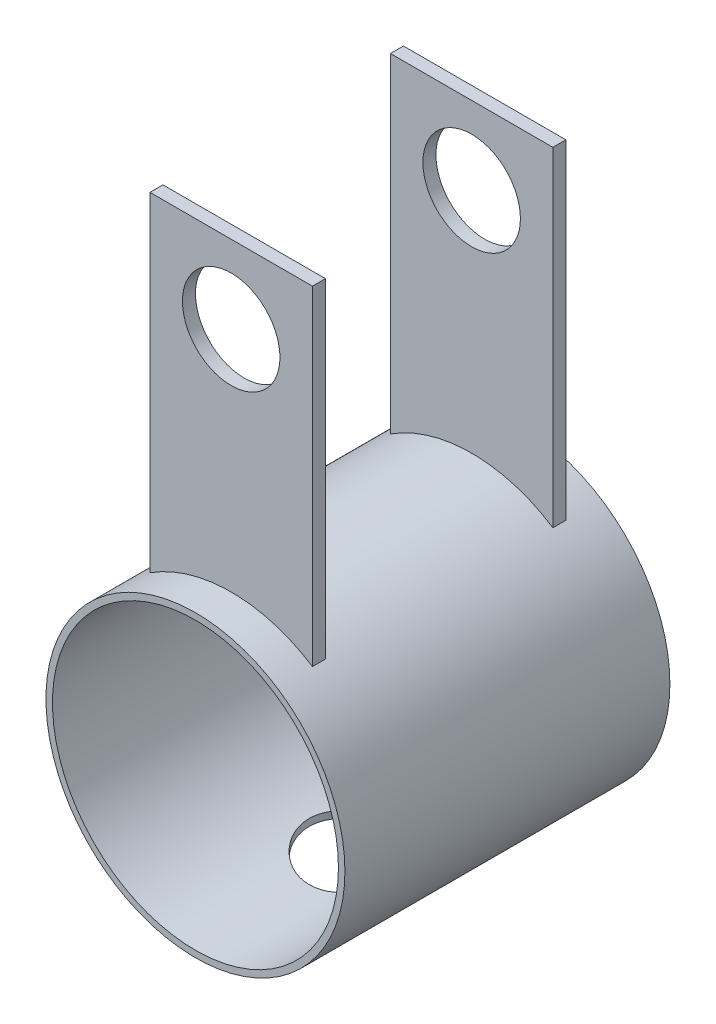
ISO-10303-21;
HEADER;
FILE_DESCRIPTION(('STEP AP214'),'2;1');
FILE_NAME('part.step','',(''),(''),'','','');
FILE_SCHEMA(('AUTOMOTIVE_DESIGN { 1 0 10303 214 1 1 1 1 }'));
ENDSEC;
DATA;
#1=APPLICATION_CONTEXT('core data for automotive mechanical design processes');
#2=APPLICATION_PROTOCOL_DEFINITION('international standard','automotive_design',2000,#1);
#3=PRODUCT_CONTEXT('',#1,'mechanical');
#4=PRODUCT('Part','Part','',(#3));
#5=PRODUCT_RELATED_PRODUCT_CATEGORY('part','',(#4));
#6=PRODUCT_DEFINITION_FORMATION('','',#4);
#7=PRODUCT_DEFINITION_CONTEXT('part definition',#1,'design');
#8=PRODUCT_DEFINITION('design','',#6,#7);
#9=PRODUCT_DEFINITION_SHAPE('','',#8);
#10=(LENGTH_UNIT() NAMED_UNIT(*) SI_UNIT(.MILLI.,.METRE.));
#11=(NAMED_UNIT(*) PLANE_ANGLE_UNIT() SI_UNIT($,.RADIAN.));
#12=(NAMED_UNIT(*) SI_UNIT($,.STERADIAN.) SOLID_ANGLE_UNIT());
#13=UNCERTAINTY_MEASURE_WITH_UNIT(LENGTH_MEASURE(1.E-05),#10,'distance_accuracy_value','');
#14=(GEOMETRIC_REPRESENTATION_CONTEXT(3) GLOBAL_UNCERTAINTY_ASSIGNED_CONTEXT((#13)) GLOBAL_UNIT_ASSIGNED_CONTEXT((#10,
#11,#12)) REPRESENTATION_CONTEXT('',''));
#15=CARTESIAN_POINT('',(0.,0.,0.));
#16=DIRECTION('',(0.,0.,1.));
#17=DIRECTION('',(1.,0.,0.));
#18=AXIS2_PLACEMENT_3D('',#15,#16,#17);
#19=CARTESIAN_POINT('',(0.,0.,50.));
#20=DIRECTION('',(0.,0.,-1.));
#21=DIRECTION('',(-1.,0.,0.));
#22=AXIS2_PLACEMENT_3D('',#19,#20,#21);
#23=CYLINDRICAL_SURFACE('',#22,23.);
#24=CARTESIAN_POINT('',(0.,0.,7.5));
#25=DIRECTION('',(0.,0.,1.));
#26=DIRECTION('',(1.,0.,0.));
#27=AXIS2_PLACEMENT_3D('',#24,#25,#26);
#28=CIRCLE('',#27,23.);
#29=CARTESIAN_POINT('',(12.5,19.3067345763078,7.5));
#30=VERTEX_POINT('',#29);
#31=CARTESIAN_POINT('',(-12.5,19.3067345763078,7.5));
#32=VERTEX_POINT('',#31);
#33=EDGE_CURVE('E154',#30,#32,#28,.T.);
#34=ORIENTED_EDGE('',*,*,#33,.T.);
#35=DIRECTION('',(0.,0.,-1.));
#36=VECTOR('',#35,1.);
#37=CARTESIAN_POINT('',(-12.5,19.3067345763078,50.));
#38=LINE('',#37,#36);
#39=CARTESIAN_POINT('',(-12.5,19.3067345763078,5.5));
#40=VERTEX_POINT('',#39);
#41=EDGE_CURVE('E133',#32,#40,#38,.T.);
#42=ORIENTED_EDGE('',*,*,#41,.T.);
#43=CARTESIAN_POINT('',(0.,0.,5.5));
#44=DIRECTION('',(0.,0.,-1.));
#45=DIRECTION('',(-1.,0.,0.));
#46=AXIS2_PLACEMENT_3D('',#43,#44,#45);
#47=CIRCLE('',#46,23.);
#48=CARTESIAN_POINT('',(12.5,19.3067345763078,5.5));
#49=VERTEX_POINT('',#48);
#50=EDGE_CURVE('E141',#40,#49,#47,.T.);
#51=ORIENTED_EDGE('',*,*,#50,.T.);
#52=DIRECTION('',(0.,0.,-1.));
#53=VECTOR('',#52,1.);
#54=CARTESIAN_POINT('',(12.5,19.3067345763078,50.));
#55=LINE('',#54,#53);
#56=EDGE_CURVE('E146',#49,#30,#55,.F.);
#57=ORIENTED_EDGE('',*,*,#56,.T.);
#58=EDGE_LOOP('',(#34,#42,#51,#57));
#59=FACE_BOUND('',#58,.T.);
#60=CARTESIAN_POINT('',(0.,0.,0.));
#61=DIRECTION('',(0.,0.,1.));
#62=DIRECTION('',(1.,0.,0.));
#63=AXIS2_PLACEMENT_3D('',#60,#61,#62);
#64=CIRCLE('',#63,23.);
#65=CARTESIAN_POINT('',(23.,0.,0.));
#66=VERTEX_POINT('',#65);
#67=EDGE_CURVE('E54',#66,#66,#64,.T.);
#68=ORIENTED_EDGE('',*,*,#67,.T.);
#69=EDGE_LOOP('',(#68));
#70=FACE_BOUND('',#69,.T.);
#71=CARTESIAN_POINT('',(0.,0.,50.));
#72=DIRECTION('',(0.,0.,1.));
#73=DIRECTION('',(1.,0.,0.));
#74=AXIS2_PLACEMENT_3D('',#71,#72,#73);
#75=CIRCLE('',#74,23.);
#76=CARTESIAN_POINT('',(23.,0.,50.));
#77=VERTEX_POINT('',#76);
#78=EDGE_CURVE('E11',#77,#77,#75,.T.);
#79=ORIENTED_EDGE('',*,*,#78,.F.);
#80=EDGE_LOOP('',(#79));
#81=FACE_BOUND('',#80,.T.);
#82=CARTESIAN_POINT('',(0.,-23.,32.5));
#83=CARTESIAN_POINT('',(0.204864398077825,-22.9999999701281,32.4999999544492));
#84=CARTESIAN_POINT('',(0.409729483335532,-22.9972565266355,32.4915993071833));
#85=CARTESIAN_POINT('',(0.817940430874261,-22.9863582353836,32.4580771636223));
#86=CARTESIAN_POINT('',(1.02128628688262,-22.9782033652937,32.4329555983277));
#87=CARTESIAN_POINT('',(1.42495892550965,-22.9567058474087,32.366229661763));
#88=CARTESIAN_POINT('',(1.6252859295165,-22.9433635819745,32.3246265053405));
#89=CARTESIAN_POINT('',(2.02158842545811,-22.9118466721847,32.2252981491143));
#90=CARTESIAN_POINT('',(2.21756221046589,-22.8936701673062,32.167566741701));
#91=CARTESIAN_POINT('',(2.60335795911659,-22.8530098099489,32.03661323981));
#92=CARTESIAN_POINT('',(2.7931916985559,-22.8305348542056,31.9634231089916));
#93=CARTESIAN_POINT('',(3.1659218811848,-22.7818424725911,31.8020759877481));
#94=CARTESIAN_POINT('',(3.34881568152042,-22.7556236387334,31.7139133641403));
#95=CARTESIAN_POINT('',(3.88522288796595,-22.6723519018028,31.4279834171268));
#96=CARTESIAN_POINT('',(4.22679727286563,-22.6106466799314,31.2086595103127));
#97=CARTESIAN_POINT('',(4.87908860045259,-22.4790745072885,30.7111975143055));
#98=CARTESIAN_POINT('',(5.18857101413069,-22.4090181188129,30.4314911568208));
#99=CARTESIAN_POINT('',(5.61483718599953,-22.3045987293917,29.9766405833901));
#100=CARTESIAN_POINT('',(5.75067195989005,-22.2698818523704,29.8190333975278));
#101=CARTESIAN_POINT('',(6.00887674600169,-22.2016035540914,29.4929488980275));
#102=CARTESIAN_POINT('',(6.13125172076029,-22.1680417101379,29.3244756272321));
#103=CARTESIAN_POINT('',(6.3649299456936,-22.1021000982874,28.9728418878896));
#104=CARTESIAN_POINT('',(6.47583140331334,-22.0697790315523,28.7894034902626));
#105=CARTESIAN_POINT('',(6.68168557230068,-22.0083305812686,28.4133561925363));
#106=CARTESIAN_POINT('',(6.77664417970125,-21.9792020184485,28.2207507166061));
#107=CARTESIAN_POINT('',(6.94987071561079,-21.9250436626736,27.8276200416096));
#108=CARTESIAN_POINT('',(7.02813914458365,-21.9000137468239,27.6270950802269));
#109=CARTESIAN_POINT('',(7.16728045909582,-21.8548724063505,27.2195596708368));
#110=CARTESIAN_POINT('',(7.22815409005887,-21.8347607709678,27.0125495011637));
#111=CARTESIAN_POINT('',(7.33023222511796,-21.8006994755901,26.6004045198862));
#112=CARTESIAN_POINT('',(7.37201049893139,-21.7865711586398,26.3954265460098));
#113=CARTESIAN_POINT('',(7.43832291674243,-21.7640203888555,25.9823926474931));
#114=CARTESIAN_POINT('',(7.46285780703575,-21.7555976890822,25.7743368564591));
#115=CARTESIAN_POINT('',(7.4944326485462,-21.7447409558839,25.3567963052872));
#116=CARTESIAN_POINT('',(7.50147683750906,-21.7423054718439,25.1473119036176));
#117=CARTESIAN_POINT('',(7.49800913723755,-21.7435016437975,24.7285088165617));
#118=CARTESIAN_POINT('',(7.48749771586201,-21.7471331381056,24.519190126908));
#119=CARTESIAN_POINT('',(7.44987197263706,-21.7600500423929,24.1114778984506));
#120=CARTESIAN_POINT('',(7.4235037903663,-21.7690812642626,23.9130068829405));
#121=CARTESIAN_POINT('',(7.3550479026826,-21.7923054200772,23.5190348113656));
#122=CARTESIAN_POINT('',(7.31295499148648,-21.8065000633686,23.3235347611904));
#123=CARTESIAN_POINT('',(7.21343613973692,-21.8396218801163,22.936951807289));
#124=CARTESIAN_POINT('',(7.15601449872671,-21.8585477264269,22.745867681249));
#125=CARTESIAN_POINT('',(7.02628566064451,-21.9005926009622,22.3692206310321));
#126=CARTESIAN_POINT('',(6.95397281727217,-21.9237132193228,22.1836598317718));
#127=CARTESIAN_POINT('',(6.79382414131515,-21.973873049864,21.8164995087054));
#128=CARTESIAN_POINT('',(6.7057690353252,-22.0009664903954,21.6350030906871));
#129=CARTESIAN_POINT('',(6.51552200339568,-22.0580560052445,21.2799800938184));
#130=CARTESIAN_POINT('',(6.41332524344255,-22.0880530710444,21.106456267356));
#131=CARTESIAN_POINT('',(6.19550466975803,-22.1501364063615,20.7684339967459));
#132=CARTESIAN_POINT('',(6.07988004419715,-22.182222802145,20.6039360991793));
#133=CARTESIAN_POINT('',(5.83593723218718,-22.2476466399192,20.2849004934379));
#134=CARTESIAN_POINT('',(5.70761861707233,-22.2809841241346,20.1303631219132));
#135=CARTESIAN_POINT('',(5.43232598794998,-22.3497416324748,19.8246513240222));
#136=CARTESIAN_POINT('',(5.28473971691789,-22.3851823788035,19.6740323061049));
#137=CARTESIAN_POINT('',(4.97739563893128,-22.4555198675406,19.3857401852122));
#138=CARTESIAN_POINT('',(4.8176417041142,-22.4904167787912,19.2480629946387));
#139=CARTESIAN_POINT('',(4.48683179272023,-22.5587427355938,18.9864462397804));
#140=CARTESIAN_POINT('',(4.3157705665263,-22.5921710871802,18.8625131289552));
#141=CARTESIAN_POINT('',(3.96355385109197,-22.6566166004235,18.6293780133665));
#142=CARTESIAN_POINT('',(3.78240238822226,-22.6876347121864,18.5201701913479));
#143=CARTESIAN_POINT('',(3.40932435647282,-22.7467032882799,18.3162789771487));
#144=CARTESIAN_POINT('',(3.21731109082556,-22.7747224286494,18.2217449717436));
#145=CARTESIAN_POINT('',(2.8255084990945,-22.8266408340333,18.0492954386801));
#146=CARTESIAN_POINT('',(2.6257222101517,-22.8505416887508,17.9713734958168));
#147=CARTESIAN_POINT('',(2.21975395287849,-22.8935438394362,17.8328045569355));
#148=CARTESIAN_POINT('',(2.01357243338107,-22.912645471373,17.7721563516325));
#149=CARTESIAN_POINT('',(1.59636212600199,-22.9454876401916,17.6687100039005));
#150=CARTESIAN_POINT('',(1.38533355107182,-22.9592284121233,17.6259110788543));
#151=CARTESIAN_POINT('',(0.968961929644398,-22.9804861176569,17.5599951894126));
#152=CARTESIAN_POINT('',(0.763748814581578,-22.9882387182572,17.5361318253778));
#153=CARTESIAN_POINT('',(0.351921722851339,-22.9982297181461,17.5054164080751));
#154=CARTESIAN_POINT('',(0.145307787867253,-23.0004682807966,17.4985638508356));
#155=CARTESIAN_POINT('',(-0.267735002897097,-22.9993688012776,17.5019357715684));
#156=CARTESIAN_POINT('',(-0.474163880904488,-22.9960315558907,17.5121578095823));
#157=CARTESIAN_POINT('',(-0.885312487277571,-22.9838751861242,17.5495750886292));
#158=CARTESIAN_POINT('',(-1.09003223163594,-22.9750561130976,17.5767701706616));
#159=CARTESIAN_POINT('',(-1.49061052505763,-22.9524989523748,17.6468867289817));
#160=CARTESIAN_POINT('',(-1.68655738986711,-22.9389040186238,17.6893513019068));
#161=CARTESIAN_POINT('',(-2.07413939735505,-22.9071117262602,17.789727250775));
#162=CARTESIAN_POINT('',(-2.26577307935494,-22.8889128332939,17.8476437767162));
#163=CARTESIAN_POINT('',(-2.6433580073612,-22.8483852066372,17.9784212729274));
#164=CARTESIAN_POINT('',(-2.8293107627117,-22.8260575812109,18.0512782333489));
#165=CARTESIAN_POINT('',(-3.19449757002501,-22.7778209071344,18.2114100508208));
#166=CARTESIAN_POINT('',(-3.37372905170509,-22.7519105057955,18.2986903558919));
#167=CARTESIAN_POINT('',(-3.72877072752962,-22.6964614904395,18.4894012957199));
#168=CARTESIAN_POINT('',(-3.90437974773982,-22.6668476878411,18.5931845642249));
#169=CARTESIAN_POINT('',(-4.24633985138765,-22.6052824810096,18.8145253333702));
#170=CARTESIAN_POINT('',(-4.41268771132593,-22.5733302717019,18.9320875863454));
#171=CARTESIAN_POINT('',(-4.73510596658522,-22.5079060781817,19.1801930853984));
#172=CARTESIAN_POINT('',(-4.89117546912445,-22.4744339623752,19.3107374566422));
#173=CARTESIAN_POINT('',(-5.19212261299557,-22.4068215881291,19.5839890308662));
#174=CARTESIAN_POINT('',(-5.33699997924745,-22.3726813132934,19.7266965326102));
#175=CARTESIAN_POINT('',(-5.62077646765426,-22.3031194570267,20.0299049276242));
#176=CARTESIAN_POINT('',(-5.75913925643339,-22.2677069350632,20.1909104107575));
#177=CARTESIAN_POINT('',(-6.02179429664564,-22.1981181963637,20.5241768474694));
#178=CARTESIAN_POINT('',(-6.1460912240825,-22.1639415713567,20.696434030361));
#179=CARTESIAN_POINT('',(-6.37985030842398,-22.097788949989,21.0512457668098));
#180=CARTESIAN_POINT('',(-6.48930638178491,-22.0658138587058,21.2338045000009));
#181=CARTESIAN_POINT('',(-6.69245611537725,-22.005051091617,21.607903980516));
#182=CARTESIAN_POINT('',(-6.78615632443825,-21.9762620932405,21.7994409535465));
#183=CARTESIAN_POINT('',(-6.95688423071991,-21.9228134814475,22.1898322556585));
#184=CARTESIAN_POINT('',(-7.03395002528407,-21.8981444621421,22.3886686172376));
#185=CARTESIAN_POINT('',(-7.17097155169386,-21.8536578206893,22.7925967976508));
#186=CARTESIAN_POINT('',(-7.23093416359697,-21.8338382482237,22.9976860642896));
#187=CARTESIAN_POINT('',(-7.33320816444159,-21.7997011251425,23.4126400995383));
#188=CARTESIAN_POINT('',(-7.37552226396384,-21.7853827296447,23.6225041295817));
#189=CARTESIAN_POINT('',(-7.4420790208139,-21.7627365428348,24.0453954939536));
#190=CARTESIAN_POINT('',(-7.4663225365011,-21.7544084669809,24.2584226775407));
#191=CARTESIAN_POINT('',(-7.49574097672057,-21.7442887157855,24.6753848916366));
#192=CARTESIAN_POINT('',(-7.50179626649647,-21.7421953088374,24.8792509704995));
#193=CARTESIAN_POINT('',(-7.4972848757701,-21.743751443038,25.2867757978861));
#194=CARTESIAN_POINT('',(-7.48671852743557,-21.7474008694216,25.4904345504716));
#195=CARTESIAN_POINT('',(-7.44906860168228,-21.760325603402,25.896022384878));
#196=CARTESIAN_POINT('',(-7.42198610588085,-21.7696005425923,26.097951579087));
#197=CARTESIAN_POINT('',(-7.35156304655139,-21.7934829736561,26.4986318377666));
#198=CARTESIAN_POINT('',(-7.30822242421128,-21.8080904848196,26.6973828907379));
#199=CARTESIAN_POINT('',(-7.20658334159779,-21.8418856286526,27.0868510153807));
#200=CARTESIAN_POINT('',(-7.14856185934451,-21.8609880352257,27.2776479385009));
#201=CARTESIAN_POINT('',(-7.01766954535154,-21.9033569020772,27.6536691060438));
#202=CARTESIAN_POINT('',(-6.94479377122529,-21.9266247479847,27.8388914720729));
#203=CARTESIAN_POINT('',(-6.78477960207665,-21.9766645945364,28.2025334416996));
#204=CARTESIAN_POINT('',(-6.69764368224833,-22.0034359868938,28.3809542192632));
#205=CARTESIAN_POINT('',(-6.50968746052728,-22.0597732027047,28.7300516232385));
#206=CARTESIAN_POINT('',(-6.40886224640708,-22.0893400281017,28.9007254402839));
#207=CARTESIAN_POINT('',(-6.18971185408284,-22.1517715327271,29.2402818245958));
#208=CARTESIAN_POINT('',(-6.07083044141912,-22.1847224838286,29.4087897094493));
#209=CARTESIAN_POINT('',(-5.81974188374734,-22.251909811877,29.7352952518903));
#210=CARTESIAN_POINT('',(-5.68753430301301,-22.2861462308319,29.8932925655326));
#211=CARTESIAN_POINT('',(-5.4105626034536,-22.3550034525514,30.1979038482372));
#212=CARTESIAN_POINT('',(-5.26579322918235,-22.3896244108614,30.3445130037776));
#213=CARTESIAN_POINT('',(-4.96466847013988,-22.4583148218903,30.6253390199508));
#214=CARTESIAN_POINT('',(-4.80831691577726,-22.4923844524403,30.7595599448755));
#215=CARTESIAN_POINT('',(-4.47889947137546,-22.5603363172559,31.019560141554));
#216=CARTESIAN_POINT('',(-4.3054285467286,-22.5941646327137,31.1448409928684));
#217=CARTESIAN_POINT('',(-3.94814929602251,-22.659326423807,31.3802718928423));
#218=CARTESIAN_POINT('',(-3.76434463397221,-22.6906607743205,31.4904272574145));
#219=CARTESIAN_POINT('',(-3.38756561357121,-22.7499617992438,31.6947985584331));
#220=CARTESIAN_POINT('',(-3.1945917492374,-22.7779286548007,31.7890153523708));
#221=CARTESIAN_POINT('',(-2.8008043020909,-22.8296938023001,31.9607201428511));
#222=CARTESIAN_POINT('',(-2.59999120750136,-22.8534923533376,32.0382091792331));
#223=CARTESIAN_POINT('',(-2.20399221774353,-22.8949708798703,32.1717135248709));
#224=CARTESIAN_POINT('',(-2.00917046640238,-22.9129284790516,32.2287240726969));
#225=CARTESIAN_POINT('',(-1.61519114769772,-22.9440666568276,32.3268247967548));
#226=CARTESIAN_POINT('',(-1.41603387493468,-22.9572475589333,32.3679160511649));
#227=CARTESIAN_POINT('',(-1.0148100453241,-22.9784792541637,32.4338067484938));
#228=CARTESIAN_POINT('',(-0.812744066357234,-22.9865310523008,32.4586093830844));
#229=CARTESIAN_POINT('',(-0.407118963933042,-22.9972914746197,32.4917061382457));
#230=CARTESIAN_POINT('',(-0.203559821194432,-23.0000000296817,32.5000000452607));
#231=CARTESIAN_POINT('',(0.,-23.,32.5));
#232=B_SPLINE_CURVE_WITH_KNOTS('',3,(#82,#83,#84,#85,#86,#87,#88,#89,#90,#91,#92,#93,#94,#95,
#96,#97,#98,#99,#100,#101,#102,#103,#104,#105,#106,#107,#108,#109,#110,#111,#112,#113,#114,#115,
#116,#117,#118,#119,#120,#121,#122,#123,#124,#125,#126,#127,#128,#129,#130,#131,#132,#133,#134,
#135,#136,#137,#138,#139,#140,#141,#142,#143,#144,#145,#146,#147,#148,#149,#150,#151,#152,#153,
#154,#155,#156,#157,#158,#159,#160,#161,#162,#163,#164,#165,#166,#167,#168,#169,#170,#171,#172,
#173,#174,#175,#176,#177,#178,#179,#180,#181,#182,#183,#184,#185,#186,#187,#188,#189,#190,#191,
#192,#193,#194,#195,#196,#197,#198,#199,#200,#201,#202,#203,#204,#205,#206,#207,#208,#209,#210,
#211,#212,#213,#214,#215,#216,#217,#218,#219,#220,#221,#222,#223,#224,#225,#226,#227,#228,#229,
#230,#231),.UNSPECIFIED.,.T.,.F.,(4,2,2,2,2,2,2,2,2,2,2,2,2,2,2,2,2,2,2,2,2,2,2,2,2,2,2,2,2,2,2,
2,2,2,2,2,2,2,2,2,2,2,2,2,2,2,2,2,2,2,2,2,2,2,2,2,2,2,2,2,2,2,2,2,2,2,2,2,2,2,2,2,2,2,4),(0.,
0.614404646009882,1.22881182740268,1.84317372966103,2.45777242049592,3.07111254650557,
3.68468394612879,4.91077132222685,6.17367447279854,6.80590909589126,7.43790983137009,
8.08745975937553,8.7367689371869,9.38605864237757,10.0353205192154,10.6635300947748,
11.2917124796733,11.919742650144,12.5477560838126,13.148306718899,13.7490563469823,
14.349637648008,14.9504470922643,15.5603902436782,16.1705424081739,16.7807314808171,
17.3909411660899,18.0316910860002,18.6722379440974,19.3130843053919,19.9536767526188,
20.600414557341,21.246902152229,21.8933444772373,22.5397584554411,23.1592135805642,
23.7786503531436,24.3979986158224,25.0173410766357,25.6195128108926,26.2218854948854,
26.8240967197693,27.426535935462,28.044211609229,28.6621009480715,29.2800438864069,
29.8980020076967,30.5429122612147,31.1876074893635,31.8325661962912,32.4772561638293,
33.120453569318,33.7633918711987,34.4062313897674,35.0490403712754,35.6601894192059,
36.2713262540553,36.882423070782,37.493522098109,38.0938548507754,38.6943876758614,
39.2948163742541,39.8954611010327,40.5212725577434,41.147104483279,41.7731995107393,
42.3990883952953,43.0482144920035,43.6971118636064,44.3459743135701,44.9947964169912,
45.6054416812058,46.2160455805486,46.8265297994508,47.437021915486),.UNSPECIFIED.);
#233=CARTESIAN_POINT('',(0.,-23.,32.5));
#234=VERTEX_POINT('',#233);
#235=EDGE_CURVE('E200',#234,#234,#232,.T.);
#236=ORIENTED_EDGE('',*,*,#235,.T.);
#237=EDGE_LOOP('',(#236));
#238=FACE_BOUND('',#237,.T.);
#239=CARTESIAN_POINT('',(0.,0.,42.5));
#240=DIRECTION('',(0.,0.,1.));
#241=DIRECTION('',(1.,0.,0.));
#242=AXIS2_PLACEMENT_3D('',#239,#240,#241);
#243=CIRCLE('',#242,23.);
#244=CARTESIAN_POINT('',(12.5,19.3067345763078,42.5));
#245=VERTEX_POINT('',#244);
#246=CARTESIAN_POINT('',(-12.5,19.3067345763078,42.5));
#247=VERTEX_POINT('',#246);
#248=EDGE_CURVE('E197',#245,#247,#243,.T.);
#249=ORIENTED_EDGE('',*,*,#248,.F.);
#250=DIRECTION('',(0.,0.,-1.));
#251=VECTOR('',#250,1.);
#252=CARTESIAN_POINT('',(12.5,19.3067345763078,50.));
#253=LINE('',#252,#251);
#254=CARTESIAN_POINT('',(12.5,19.3067345763078,44.5));
#255=VERTEX_POINT('',#254);
#256=EDGE_CURVE('E187',#255,#245,#253,.T.);
#257=ORIENTED_EDGE('',*,*,#256,.F.);
#258=CARTESIAN_POINT('',(0.,0.,44.5));
#259=DIRECTION('',(0.,0.,-1.));
#260=DIRECTION('',(-1.,0.,0.));
#261=AXIS2_PLACEMENT_3D('',#258,#259,#260);
#262=CIRCLE('',#261,23.);
#263=CARTESIAN_POINT('',(-12.5,19.3067345763078,44.5));
#264=VERTEX_POINT('',#263);
#265=EDGE_CURVE('E191',#264,#255,#262,.T.);
#266=ORIENTED_EDGE('',*,*,#265,.F.);
#267=DIRECTION('',(0.,0.,-1.));
#268=VECTOR('',#267,1.);
#269=CARTESIAN_POINT('',(-12.5,19.3067345763078,50.));
#270=LINE('',#269,#268);
#271=EDGE_CURVE('E70',#247,#264,#270,.F.);
#272=ORIENTED_EDGE('',*,*,#271,.F.);
#273=EDGE_LOOP('',(#249,#257,#266,#272));
#274=FACE_BOUND('',#273,.T.);
#275=ADVANCED_FACE('F39',(#59,#70,#81,#238,#274),#23,.T.);
#276=CARTESIAN_POINT('',(0.,0.,50.));
#277=DIRECTION('',(0.,0.,-1.));
#278=DIRECTION('',(-1.,0.,0.));
#279=AXIS2_PLACEMENT_3D('',#276,#277,#278);
#280=CYLINDRICAL_SURFACE('',#279,22.);
#281=CARTESIAN_POINT('',(0.,0.,0.));
#282=DIRECTION('',(0.,0.,1.));
#283=DIRECTION('',(1.,0.,0.));
#284=AXIS2_PLACEMENT_3D('',#281,#282,#283);
#285=CIRCLE('',#284,22.);
#286=CARTESIAN_POINT('',(22.,0.,0.));
#287=VERTEX_POINT('',#286);
#288=EDGE_CURVE('E207',#287,#287,#285,.T.);
#289=ORIENTED_EDGE('',*,*,#288,.F.);
#290=EDGE_LOOP('',(#289));
#291=FACE_BOUND('',#290,.T.);
#292=CARTESIAN_POINT('',(0.,0.,50.));
#293=DIRECTION('',(0.,0.,1.));
#294=DIRECTION('',(1.,0.,0.));
#295=AXIS2_PLACEMENT_3D('',#292,#293,#294);
#296=CIRCLE('',#295,22.);
#297=CARTESIAN_POINT('',(22.,0.,50.));
#298=VERTEX_POINT('',#297);
#299=EDGE_CURVE('E208',#298,#298,#296,.T.);
#300=ORIENTED_EDGE('',*,*,#299,.T.);
#301=EDGE_LOOP('',(#300));
#302=FACE_BOUND('',#301,.T.);
#303=CARTESIAN_POINT('',(0.,-22.,32.5));
#304=CARTESIAN_POINT('',(0.204306828495646,-22.0000001494581,32.5000002185132));
#305=CARTESIAN_POINT('',(0.408610382519935,-21.9971475610358,32.4916451171794));
#306=CARTESIAN_POINT('',(0.815771102953668,-21.985813798821,32.4583010359896));
#307=CARTESIAN_POINT('',(1.01862773037379,-21.9773306280381,32.4333061545172));
#308=CARTESIAN_POINT('',(1.42126446837239,-21.9549687207925,32.3669278322593));
#309=CARTESIAN_POINT('',(1.62104560000676,-21.9410918170282,32.3255499580457));
#310=CARTESIAN_POINT('',(2.01626180617415,-21.9083094883704,32.2267692674307));
#311=CARTESIAN_POINT('',(2.2116951737434,-21.8894021249601,32.1693602729202));
#312=CARTESIAN_POINT('',(2.5963973083212,-21.847107187426,32.0391669858062));
#313=CARTESIAN_POINT('',(2.78567830649377,-21.823729231007,31.966415665631));
#314=CARTESIAN_POINT('',(3.15735797762389,-21.7730633085152,31.8060321825946));
#315=CARTESIAN_POINT('',(3.33975420652253,-21.7457739701101,31.7183947948598));
#316=CARTESIAN_POINT('',(3.69647457649215,-21.6879857627263,31.5289251044443));
#317=CARTESIAN_POINT('',(3.87079893507584,-21.6574869803052,31.4270931845605));
#318=CARTESIAN_POINT('',(4.21036929119327,-21.5940415487637,31.2099444469037));
#319=CARTESIAN_POINT('',(4.37561491282334,-21.5610947984183,31.0946270713851));
#320=CARTESIAN_POINT('',(4.70132365038727,-21.4924673655282,30.8472835541794));
#321=CARTESIAN_POINT('',(4.86145460122856,-21.4567325472868,30.7148348842944));
#322=CARTESIAN_POINT('',(5.17003513167113,-21.3844767463222,30.4372597055798));
#323=CARTESIAN_POINT('',(5.31848826951736,-21.3479560074235,30.2921370871823));
#324=CARTESIAN_POINT('',(5.60296144762952,-21.2750651910773,29.9899802088394));
#325=CARTESIAN_POINT('',(5.73897433755723,-21.2386952116049,29.8329391922041));
#326=CARTESIAN_POINT('',(5.99757548896344,-21.1671227638791,29.5080135522819));
#327=CARTESIAN_POINT('',(6.12016859279571,-21.131919877713,29.3401328753397));
#328=CARTESIAN_POINT('',(6.35473569897824,-21.0625913412805,28.9891410223163));
#329=CARTESIAN_POINT('',(6.466266451669,-21.0285322441354,28.8057200362414));
#330=CARTESIAN_POINT('',(6.67337018101166,-20.9637283423322,28.4296064365936));
#331=CARTESIAN_POINT('',(6.76894908359417,-20.9329823084198,28.2369173004544));
#332=CARTESIAN_POINT('',(6.94339601564666,-20.8757678747493,27.8435096483478));
#333=CARTESIAN_POINT('',(7.02226491852303,-20.8492992514346,27.6427915526941));
#334=CARTESIAN_POINT('',(7.16256963175481,-20.8015166923502,27.2347558619229));
#335=CARTESIAN_POINT('',(7.224006267167,-20.7802025126315,27.0274385796569));
#336=CARTESIAN_POINT('',(7.32699984865459,-20.7441063278536,26.6151262065948));
#337=CARTESIAN_POINT('',(7.36917735453764,-20.729121796665,26.4103038266804));
#338=CARTESIAN_POINT('',(7.43630876035399,-20.7051343318475,25.9975127988665));
#339=CARTESIAN_POINT('',(7.46126349024683,-20.6961311099822,25.789544303071));
#340=CARTESIAN_POINT('',(7.49368614585537,-20.6844136107064,25.3721275027475));
#341=CARTESIAN_POINT('',(7.50115876501551,-20.6816976453501,25.1626796105445));
#342=CARTESIAN_POINT('',(7.49855038783964,-20.6826435839731,24.7439109148199));
#343=CARTESIAN_POINT('',(7.48846991697827,-20.6863052970282,24.5345901076814));
#344=CARTESIAN_POINT('',(7.45177574089562,-20.6995505173018,24.1278145191661));
#345=CARTESIAN_POINT('',(7.42598473773309,-20.7088392335852,23.9302752321643));
#346=CARTESIAN_POINT('',(7.35883867485487,-20.7327943812435,23.5381251426326));
#347=CARTESIAN_POINT('',(7.31747848364289,-20.7474625856195,23.3435153276537));
#348=CARTESIAN_POINT('',(7.21958052881828,-20.7817309446074,22.9586589233737));
#349=CARTESIAN_POINT('',(7.16304691823211,-20.8013297496022,22.768411155605));
#350=CARTESIAN_POINT('',(7.03524996182191,-20.8448989597121,22.3933695735019));
#351=CARTESIAN_POINT('',(6.96398101473891,-20.8688710268013,22.2085778637628));
#352=CARTESIAN_POINT('',(6.80600790159705,-20.9209292467831,21.8426898690308));
#353=CARTESIAN_POINT('',(6.71907174685214,-20.9490759198448,21.6617024207756));
#354=CARTESIAN_POINT('',(6.53118545240552,-21.0084107083522,21.3076017274629));
#355=CARTESIAN_POINT('',(6.43023052884685,-21.039599860948,21.1344911972641));
#356=CARTESIAN_POINT('',(6.21500442779764,-21.1041782433554,20.79717360322));
#357=CARTESIAN_POINT('',(6.10073222815018,-21.1375676419595,20.6329672242251));
#358=CARTESIAN_POINT('',(5.85959089389396,-21.2056805898317,20.3143717959002));
#359=CARTESIAN_POINT('',(5.73272129242014,-21.2404041885165,20.1599831107662));
#360=CARTESIAN_POINT('',(5.45981932468471,-21.3122348706819,19.8536684692454));
#361=CARTESIAN_POINT('',(5.31311678247761,-21.3493680057193,19.7023450052435));
#362=CARTESIAN_POINT('',(5.00748376110617,-21.4231138538417,19.4125640707858));
#363=CARTESIAN_POINT('',(4.84855712571956,-21.4597267262641,19.2741025859623));
#364=CARTESIAN_POINT('',(4.51932400470682,-21.531467757366,19.0108300589177));
#365=CARTESIAN_POINT('',(4.34901203878829,-21.5665951875572,18.8860256678257));
#366=CARTESIAN_POINT('',(3.99819753066057,-21.6343780933023,18.6510656663987));
#367=CARTESIAN_POINT('',(3.81769906688946,-21.6670345460909,18.5409042518031));
#368=CARTESIAN_POINT('',(3.44550830668523,-21.7293457516027,18.3348500841813));
#369=CARTESIAN_POINT('',(3.25371285289363,-21.7589625648705,18.2391319628447));
#370=CARTESIAN_POINT('',(2.86218836570707,-21.8139160673251,18.0643081664008));
#371=CARTESIAN_POINT('',(2.66246245663408,-21.8392544218106,17.9851960248421));
#372=CARTESIAN_POINT('',(2.2564593500687,-21.884928913274,17.8442638208395));
#373=CARTESIAN_POINT('',(2.0501827673692,-21.905265518118,17.7824421409631));
#374=CARTESIAN_POINT('',(1.63262897715892,-21.9403374273945,17.6766879519455));
#375=CARTESIAN_POINT('',(1.42135201207521,-21.955073002786,17.6327545774209));
#376=CARTESIAN_POINT('',(1.00508533777263,-21.9779725746602,17.5647964296725));
#377=CARTESIAN_POINT('',(0.800242020149529,-21.9864030621509,17.5399628805843));
#378=CARTESIAN_POINT('',(0.389052790865807,-21.9975210221437,17.5072588540647));
#379=CARTESIAN_POINT('',(0.182706929052588,-22.0002086843027,17.4993878164457));
#380=CARTESIAN_POINT('',(-0.229891306884664,-21.9997660160866,17.500686395902));
#381=CARTESIAN_POINT('',(-0.436143690589079,-21.9966365968533,17.5098533442814));
#382=CARTESIAN_POINT('',(-0.847023922090942,-21.9846489786936,17.5451314038763));
#383=CARTESIAN_POINT('',(-1.0516517875871,-21.975790842267,17.5712423302345));
#384=CARTESIAN_POINT('',(-1.45149823436824,-21.9529500756626,17.6390896569393));
#385=CARTESIAN_POINT('',(-1.64681250938206,-21.9391336725107,17.6803200549268));
#386=CARTESIAN_POINT('',(-2.03322509929433,-21.9067021982317,17.7781077053454));
#387=CARTESIAN_POINT('',(-2.22432199055871,-21.8880855328171,17.8346700502215));
#388=CARTESIAN_POINT('',(-2.60093795819394,-21.8465330941485,17.9626236432132));
#389=CARTESIAN_POINT('',(-2.78645851730736,-21.8235984810283,18.0340109087412));
#390=CARTESIAN_POINT('',(-3.15089694505572,-21.773968080912,18.1910912651026));
#391=CARTESIAN_POINT('',(-3.32981228365061,-21.7472708711857,18.2767897696439));
#392=CARTESIAN_POINT('',(-3.68457162481484,-21.6900223303291,18.4643095944267));
#393=CARTESIAN_POINT('',(-3.86020761180549,-21.6593874226969,18.5664988917508));
#394=CARTESIAN_POINT('',(-4.20235360405741,-21.5956135211168,18.7845838958051));
#395=CARTESIAN_POINT('',(-4.36886043533964,-21.5624736656677,18.9004843258818));
#396=CARTESIAN_POINT('',(-4.69174940451459,-21.4945274994889,19.1452131293754));
#397=CARTESIAN_POINT('',(-4.84813046326199,-21.4597210118247,19.2740428770044));
#398=CARTESIAN_POINT('',(-5.14986850094033,-21.3893165119534,19.5438277769373));
#399=CARTESIAN_POINT('',(-5.29522517188262,-21.3537184776688,19.6847832677639));
#400=CARTESIAN_POINT('',(-5.58076500628776,-21.2809257137553,19.9850216128647));
#401=CARTESIAN_POINT('',(-5.72036725535786,-21.2437361405122,20.144858835936));
#402=CARTESIAN_POINT('',(-5.98560228794375,-21.1705335932911,20.4758940164783));
#403=CARTESIAN_POINT('',(-6.11123966734159,-21.134520234989,20.6470882065413));
#404=CARTESIAN_POINT('',(-6.34778485749797,-21.0646824577178,20.9999058736812));
#405=CARTESIAN_POINT('',(-6.45868630139871,-21.0308589881346,21.1815338105669));
#406=CARTESIAN_POINT('',(-6.66482132139409,-20.9664450643343,21.5539257577118));
#407=CARTESIAN_POINT('',(-6.76006144029942,-20.9358532619476,21.7446859095937));
#408=CARTESIAN_POINT('',(-6.93408822301068,-20.8788602369339,22.1340180654973));
#409=CARTESIAN_POINT('',(-7.01288629319482,-20.8524561122514,22.3325845396126));
#410=CARTESIAN_POINT('',(-7.15337504718499,-20.8046806069255,22.7361844126276));
#411=CARTESIAN_POINT('',(-7.21507269623544,-20.7833071777449,22.9412151405327));
#412=CARTESIAN_POINT('',(-7.32078912175291,-20.7463054041981,23.3562558304563));
#413=CARTESIAN_POINT('',(-7.36481133924331,-20.7306759416562,23.5662648148773));
#414=CARTESIAN_POINT('',(-7.43473001122427,-20.7057039173645,23.9896452079508));
#415=CARTESIAN_POINT('',(-7.46062743664842,-20.6963610188484,24.203016435864));
#416=CARTESIAN_POINT('',(-7.4931186724778,-20.6846186561952,24.6198642569417));
#417=CARTESIAN_POINT('',(-7.5006746881606,-20.6818731705239,24.823256673753));
#418=CARTESIAN_POINT('',(-7.49923086350347,-20.6823968394937,25.2299734052873));
#419=CARTESIAN_POINT('',(-7.49023141187257,-20.6856658529191,25.4332977214972));
#420=CARTESIAN_POINT('',(-7.45576887682982,-20.6981120723805,25.8383450624621));
#421=CARTESIAN_POINT('',(-7.4303070088182,-20.7072888422537,26.0400682043171));
#422=CARTESIAN_POINT('',(-7.36317111054065,-20.7312560783322,26.440456968315));
#423=CARTESIAN_POINT('',(-7.32149703673454,-20.7460465596139,26.6391225822449));
#424=CARTESIAN_POINT('',(-7.22337294555033,-20.7804119782705,27.0278619009391));
#425=CARTESIAN_POINT('',(-7.1672522204043,-20.7998797169424,27.2180284332699));
#426=CARTESIAN_POINT('',(-7.04030158838265,-20.8431919129596,27.5929397411806));
#427=CARTESIAN_POINT('',(-6.96946678924234,-20.8670378256916,27.7776826901033));
#428=CARTESIAN_POINT('',(-6.81366563876729,-20.9184292719342,28.1405316076064));
#429=CARTESIAN_POINT('',(-6.72870176360072,-20.945974157025,28.3186387324543));
#430=CARTESIAN_POINT('',(-6.54520886461325,-21.0040353380256,28.6672968986524));
#431=CARTESIAN_POINT('',(-6.44667469178027,-21.0345527605199,28.8378450392552));
#432=CARTESIAN_POINT('',(-6.23199146999318,-21.0991801413973,29.1778584410361));
#433=CARTESIAN_POINT('',(-6.11524992309091,-21.1333899041251,29.3469308126758));
#434=CARTESIAN_POINT('',(-5.86841873294479,-21.2032571707637,29.674803252866));
#435=CARTESIAN_POINT('',(-5.73832443888386,-21.2389151764724,29.833599710659));
#436=CARTESIAN_POINT('',(-5.46561113594613,-21.3107243946762,30.1399567079556));
#437=CARTESIAN_POINT('',(-5.32299085092031,-21.3468756571067,30.28751609976));
#438=CARTESIAN_POINT('',(-5.02608184867421,-21.4187261071718,30.570508318086));
#439=CARTESIAN_POINT('',(-4.87179302109255,-21.4544252905269,30.7059410298867));
#440=CARTESIAN_POINT('',(-4.54576711720468,-21.5259144816779,30.9692306669478));
#441=CARTESIAN_POINT('',(-4.37357050989504,-21.5616460544173,31.0965352284531));
#442=CARTESIAN_POINT('',(-4.01863769691094,-21.6306083602673,31.3361169994372));
#443=CARTESIAN_POINT('',(-3.83590525215998,-21.6638399761307,31.4483995243112));
#444=CARTESIAN_POINT('',(-3.46098849144232,-21.726888776989,31.657146694719));
#445=CARTESIAN_POINT('',(-3.26880185485344,-21.7567051176335,31.7536074312046));
#446=CARTESIAN_POINT('',(-2.87641716437504,-21.8120484016285,31.9298235427266));
#447=CARTESIAN_POINT('',(-2.67622270864778,-21.837577245264,32.0095863224398));
#448=CARTESIAN_POINT('',(-2.27511959958032,-21.8829470528705,32.1496597271587));
#449=CARTESIAN_POINT('',(-2.0744013950803,-21.9029319632911,32.2104690324115));
#450=CARTESIAN_POINT('',(-1.66822331243048,-21.9376059019302,32.3151208113484));
#451=CARTESIAN_POINT('',(-1.46276542759694,-21.9522971147663,32.3589702846117));
#452=CARTESIAN_POINT('',(-1.04858442166121,-21.9759753524852,32.4293062186455));
#453=CARTESIAN_POINT('',(-0.839861502018706,-21.9849627278958,32.4557937463926));
#454=CARTESIAN_POINT('',(-0.420757875253617,-21.9969749145713,32.4911403467841));
#455=CARTESIAN_POINT('',(-0.210377201654537,-21.9999998461012,32.4999997749944));
#456=CARTESIAN_POINT('',(0.,-22.,32.5));
#457=B_SPLINE_CURVE_WITH_KNOTS('',3,(#303,#304,#305,#306,#307,#308,#309,#310,#311,#312,#313,
#314,#315,#316,#317,#318,#319,#320,#321,#322,#323,#324,#325,#326,#327,#328,#329,#330,#331,#332,
#333,#334,#335,#336,#337,#338,#339,#340,#341,#342,#343,#344,#345,#346,#347,#348,#349,#350,#351,
#352,#353,#354,#355,#356,#357,#358,#359,#360,#361,#362,#363,#364,#365,#366,#367,#368,#369,#370,
#371,#372,#373,#374,#375,#376,#377,#378,#379,#380,#381,#382,#383,#384,#385,#386,#387,#388,#389,
#390,#391,#392,#393,#394,#395,#396,#397,#398,#399,#400,#401,#402,#403,#404,#405,#406,#407,#408,
#409,#410,#411,#412,#413,#414,#415,#416,#417,#418,#419,#420,#421,#422,#423,#424,#425,#426,#427,
#428,#429,#430,#431,#432,#433,#434,#435,#436,#437,#438,#439,#440,#441,#442,#443,#444,#445,#446,
#447,#448,#449,#450,#451,#452,#453,#454,#455,#456),.UNSPECIFIED.,.T.,.F.,(4,2,2,2,2,2,2,2,2,2,2,
2,2,2,2,2,2,2,2,2,2,2,2,2,2,2,2,2,2,2,2,2,2,2,2,2,2,2,2,2,2,2,2,2,2,2,2,2,2,2,2,2,2,2,2,2,2,2,2,
2,2,2,2,2,2,2,2,2,2,2,2,2,2,2,2,2,4),(0.,0.61272510084955,1.22566763223779,1.83840207803946,
2.45137298748304,3.06303973720067,3.67492162165971,4.28678700812928,4.89867770972593,
5.53054117009712,6.16221134901547,6.7942423438124,7.42604452148049,8.07730219398849,
8.72831739056492,9.3792985511629,10.030248896146,10.6584147021731,11.286550234996,
11.9145171121144,12.5424651905489,13.1400607726672,13.737853490843,14.3354827572861,
14.9333396161588,15.540911003422,16.1486902341981,16.7565161453473,17.3643645911971,
18.0056452183185,18.6467250173145,19.2881156514125,19.9292512846784,20.5776060844647,
21.2257079413504,21.8737491513948,22.5217590073941,23.1405330984435,23.7592867541431,
24.3779435013118,24.996593499099,25.5961902295778,26.1959863582719,26.79562156485,
27.3954841196054,28.0112898970877,28.627308434576,29.243392516008,29.8594938026648,
30.5050932928913,31.1504796812687,31.7961440169704,32.4415379252732,33.0864826034577,
33.7311641991662,34.3757202284184,35.0202417265703,35.6301414467357,36.2400268471299,
36.8498672255662,37.4597092418271,38.056721730381,38.6539330375353,39.2510397914847,
39.8483737345628,40.4725440495362,41.0969325081496,41.7213846534678,42.3458427056092,
42.9963721124272,43.6466707237753,44.2971297614852,44.9472997405081,45.5785424647626,
46.209524386889,46.8404675284475,47.4713979434971),.UNSPECIFIED.);
#458=CARTESIAN_POINT('',(0.,-22.,32.5));
#459=VERTEX_POINT('',#458);
#460=EDGE_CURVE('E43',#459,#459,#457,.T.);
#461=ORIENTED_EDGE('',*,*,#460,.F.);
#462=EDGE_LOOP('',(#461));
#463=FACE_BOUND('',#462,.T.);
#464=ADVANCED_FACE('F219',(#291,#302,#463),#280,.F.);
#465=CARTESIAN_POINT('',(0.,0.,50.));
#466=DIRECTION('',(0.,0.,1.));
#467=DIRECTION('',(1.,0.,0.));
#468=AXIS2_PLACEMENT_3D('',#465,#466,#467);
#469=PLANE('',#468);
#470=ORIENTED_EDGE('',*,*,#78,.T.);
#471=EDGE_LOOP('',(#470));
#472=FACE_BOUND('',#471,.T.);
#473=ORIENTED_EDGE('',*,*,#299,.F.);
#474=EDGE_LOOP('',(#473));
#475=FACE_BOUND('',#474,.T.);
#476=ADVANCED_FACE('F224',(#472,#475),#469,.T.);
#477=CARTESIAN_POINT('',(0.,0.,0.));
#478=DIRECTION('',(0.,0.,1.));
#479=DIRECTION('',(1.,0.,0.));
#480=AXIS2_PLACEMENT_3D('',#477,#478,#479);
#481=PLANE('',#480);
#482=ORIENTED_EDGE('',*,*,#67,.F.);
#483=EDGE_LOOP('',(#482));
#484=FACE_BOUND('',#483,.T.);
#485=ORIENTED_EDGE('',*,*,#288,.T.);
#486=EDGE_LOOP('',(#485));
#487=FACE_BOUND('',#486,.T.);
#488=ADVANCED_FACE('F215',(#484,#487),#481,.F.);
#489=CARTESIAN_POINT('',(0.,-50.,25.));
#490=DIRECTION('',(0.,1.,0.));
#491=DIRECTION('',(0.,0.,1.));
#492=AXIS2_PLACEMENT_3D('',#489,#490,#491);
#493=CYLINDRICAL_SURFACE('',#492,7.5);
#494=ORIENTED_EDGE('',*,*,#460,.T.);
#495=EDGE_LOOP('',(#494));
#496=FACE_BOUND('',#495,.T.);
#497=ORIENTED_EDGE('',*,*,#235,.F.);
#498=EDGE_LOOP('',(#497));
#499=FACE_BOUND('',#498,.T.);
#500=ADVANCED_FACE('F210',(#496,#499),#493,.F.);
#501=CARTESIAN_POINT('',(-12.5,70.,42.5));
#502=DIRECTION('',(1.,0.,0.));
#503=DIRECTION('',(0.,0.,-1.));
#504=AXIS2_PLACEMENT_3D('',#501,#502,#503);
#505=PLANE('',#504);
#506=DIRECTION('',(0.,-1.,0.));
#507=VECTOR('',#506,1.);
#508=CARTESIAN_POINT('',(-12.5,70.,42.5));
#509=LINE('',#508,#507);
#510=CARTESIAN_POINT('',(-12.5,70.,42.5));
#511=VERTEX_POINT('',#510);
#512=EDGE_CURVE('E183',#511,#247,#509,.T.);
#513=ORIENTED_EDGE('',*,*,#512,.T.);
#514=ORIENTED_EDGE('',*,*,#271,.T.);
#515=DIRECTION('',(0.,-1.,0.));
#516=VECTOR('',#515,1.);
#517=CARTESIAN_POINT('',(-12.5,70.,44.5));
#518=LINE('',#517,#516);
#519=CARTESIAN_POINT('',(-12.5,70.,44.5));
#520=VERTEX_POINT('',#519);
#521=EDGE_CURVE('E179',#520,#264,#518,.T.);
#522=ORIENTED_EDGE('',*,*,#521,.F.);
#523=DIRECTION('',(0.,0.,1.));
#524=VECTOR('',#523,1.);
#525=CARTESIAN_POINT('',(-12.5,70.,42.5));
#526=LINE('',#525,#524);
#527=EDGE_CURVE('E162',#511,#520,#526,.T.);
#528=ORIENTED_EDGE('',*,*,#527,.F.);
#529=EDGE_LOOP('',(#513,#514,#522,#528));
#530=FACE_BOUND('',#529,.T.);
#531=ADVANCED_FACE('F214',(#530),#505,.F.);
#532=CARTESIAN_POINT('',(12.5,70.,44.5));
#533=DIRECTION('',(-1.,0.,0.));
#534=DIRECTION('',(0.,0.,1.));
#535=AXIS2_PLACEMENT_3D('',#532,#533,#534);
#536=PLANE('',#535);
#537=DIRECTION('',(0.,-1.,0.));
#538=VECTOR('',#537,1.);
#539=CARTESIAN_POINT('',(12.5,70.,44.5));
#540=LINE('',#539,#538);
#541=CARTESIAN_POINT('',(12.5,70.,44.5));
#542=VERTEX_POINT('',#541);
#543=EDGE_CURVE('E175',#542,#255,#540,.T.);
#544=ORIENTED_EDGE('',*,*,#543,.T.);
#545=ORIENTED_EDGE('',*,*,#256,.T.);
#546=DIRECTION('',(0.,-1.,0.));
#547=VECTOR('',#546,1.);
#548=CARTESIAN_POINT('',(12.5,70.,42.5));
#549=LINE('',#548,#547);
#550=CARTESIAN_POINT('',(12.5,70.,42.5));
#551=VERTEX_POINT('',#550);
#552=EDGE_CURVE('E171',#551,#245,#549,.T.);
#553=ORIENTED_EDGE('',*,*,#552,.F.);
#554=DIRECTION('',(0.,0.,-1.));
#555=VECTOR('',#554,1.);
#556=CARTESIAN_POINT('',(12.5,70.,44.5));
#557=LINE('',#556,#555);
#558=EDGE_CURVE('E168',#542,#551,#557,.T.);
#559=ORIENTED_EDGE('',*,*,#558,.F.);
#560=EDGE_LOOP('',(#544,#545,#553,#559));
#561=FACE_BOUND('',#560,.T.);
#562=ADVANCED_FACE('F248',(#561),#536,.F.);
#563=CARTESIAN_POINT('',(0.,70.,42.5));
#564=DIRECTION('',(0.,0.,1.));
#565=DIRECTION('',(1.,0.,0.));
#566=AXIS2_PLACEMENT_3D('',#563,#564,#565);
#567=PLANE('',#566);
#568=CARTESIAN_POINT('',(0.,58.,42.5));
#569=DIRECTION('',(0.,0.,1.));
#570=DIRECTION('',(1.,0.,0.));
#571=AXIS2_PLACEMENT_3D('',#568,#569,#570);
#572=CIRCLE('',#571,7.5);
#573=CARTESIAN_POINT('',(7.5,58.,42.5));
#574=VERTEX_POINT('',#573);
#575=EDGE_CURVE('E135',#574,#574,#572,.T.);
#576=ORIENTED_EDGE('',*,*,#575,.T.);
#577=EDGE_LOOP('',(#576));
#578=FACE_BOUND('',#577,.T.);
#579=ORIENTED_EDGE('',*,*,#552,.T.);
#580=ORIENTED_EDGE('',*,*,#248,.T.);
#581=ORIENTED_EDGE('',*,*,#512,.F.);
#582=DIRECTION('',(-1.,0.,0.));
#583=VECTOR('',#582,1.);
#584=CARTESIAN_POINT('',(12.5,70.,42.5));
#585=LINE('',#584,#583);
#586=EDGE_CURVE('E159',#551,#511,#585,.T.);
#587=ORIENTED_EDGE('',*,*,#586,.F.);
#588=EDGE_LOOP('',(#579,#580,#581,#587));
#589=FACE_BOUND('',#588,.T.);
#590=ADVANCED_FACE('F217',(#578,#589),#567,.F.);
#591=CARTESIAN_POINT('',(-12.5,70.,44.5));
#592=DIRECTION('',(0.,0.,-1.));
#593=DIRECTION('',(-1.,0.,0.));
#594=AXIS2_PLACEMENT_3D('',#591,#592,#593);
#595=PLANE('',#594);
#596=CARTESIAN_POINT('',(0.,58.,44.5));
#597=DIRECTION('',(0.,0.,-1.));
#598=DIRECTION('',(-1.,0.,0.));
#599=AXIS2_PLACEMENT_3D('',#596,#597,#598);
#600=CIRCLE('',#599,7.5);
#601=CARTESIAN_POINT('',(-7.5,58.,44.5));
#602=VERTEX_POINT('',#601);
#603=EDGE_CURVE('E304',#602,#602,#600,.T.);
#604=ORIENTED_EDGE('',*,*,#603,.T.);
#605=EDGE_LOOP('',(#604));
#606=FACE_BOUND('',#605,.T.);
#607=ORIENTED_EDGE('',*,*,#521,.T.);
#608=ORIENTED_EDGE('',*,*,#265,.T.);
#609=ORIENTED_EDGE('',*,*,#543,.F.);
#610=DIRECTION('',(1.,0.,0.));
#611=VECTOR('',#610,1.);
#612=CARTESIAN_POINT('',(-12.5,70.,44.5));
#613=LINE('',#612,#611);
#614=EDGE_CURVE('E165',#520,#542,#613,.T.);
#615=ORIENTED_EDGE('',*,*,#614,.F.);
#616=EDGE_LOOP('',(#607,#608,#609,#615));
#617=FACE_BOUND('',#616,.T.);
#618=ADVANCED_FACE('F258',(#606,#617),#595,.F.);
#619=CARTESIAN_POINT('',(0.,70.,0.));
#620=DIRECTION('',(0.,1.,0.));
#621=DIRECTION('',(0.,0.,1.));
#622=AXIS2_PLACEMENT_3D('',#619,#620,#621);
#623=PLANE('',#622);
#624=ORIENTED_EDGE('',*,*,#586,.T.);
#625=ORIENTED_EDGE('',*,*,#527,.T.);
#626=ORIENTED_EDGE('',*,*,#614,.T.);
#627=ORIENTED_EDGE('',*,*,#558,.T.);
#628=EDGE_LOOP('',(#624,#625,#626,#627));
#629=FACE_BOUND('',#628,.T.);
#630=ADVANCED_FACE('F254',(#629),#623,.T.);
#631=CARTESIAN_POINT('',(-12.5,70.,7.5));
#632=DIRECTION('',(-1.,0.,0.));
#633=DIRECTION('',(0.,0.,1.));
#634=AXIS2_PLACEMENT_3D('',#631,#632,#633);
#635=PLANE('',#634);
#636=ORIENTED_EDGE('',*,*,#41,.F.);
#637=DIRECTION('',(0.,-1.,0.));
#638=VECTOR('',#637,1.);
#639=CARTESIAN_POINT('',(-12.5,70.,7.5));
#640=LINE('',#639,#638);
#641=CARTESIAN_POINT('',(-12.5,70.,7.5));
#642=VERTEX_POINT('',#641);
#643=EDGE_CURVE('E115',#642,#32,#640,.T.);
#644=ORIENTED_EDGE('',*,*,#643,.F.);
#645=DIRECTION('',(0.,0.,-1.));
#646=VECTOR('',#645,1.);
#647=CARTESIAN_POINT('',(-12.5,70.,7.5));
#648=LINE('',#647,#646);
#649=CARTESIAN_POINT('',(-12.5,70.,5.5));
#650=VERTEX_POINT('',#649);
#651=EDGE_CURVE('E131',#642,#650,#648,.T.);
#652=ORIENTED_EDGE('',*,*,#651,.T.);
#653=DIRECTION('',(0.,-1.,0.));
#654=VECTOR('',#653,1.);
#655=CARTESIAN_POINT('',(-12.5,70.,5.5));
#656=LINE('',#655,#654);
#657=EDGE_CURVE('E125',#650,#40,#656,.T.);
#658=ORIENTED_EDGE('',*,*,#657,.T.);
#659=EDGE_LOOP('',(#636,#644,#652,#658));
#660=FACE_BOUND('',#659,.T.);
#661=ADVANCED_FACE('F129',(#660),#635,.T.);
#662=CARTESIAN_POINT('',(12.5,70.,5.5));
#663=DIRECTION('',(1.,0.,0.));
#664=DIRECTION('',(0.,0.,-1.));
#665=AXIS2_PLACEMENT_3D('',#662,#663,#664);
#666=PLANE('',#665);
#667=ORIENTED_EDGE('',*,*,#56,.F.);
#668=DIRECTION('',(0.,-1.,0.));
#669=VECTOR('',#668,1.);
#670=CARTESIAN_POINT('',(12.5,70.,5.5));
#671=LINE('',#670,#669);
#672=CARTESIAN_POINT('',(12.5,70.,5.5));
#673=VERTEX_POINT('',#672);
#674=EDGE_CURVE('E62',#673,#49,#671,.T.);
#675=ORIENTED_EDGE('',*,*,#674,.F.);
#676=DIRECTION('',(0.,0.,1.));
#677=VECTOR('',#676,1.);
#678=CARTESIAN_POINT('',(12.5,70.,5.5));
#679=LINE('',#678,#677);
#680=CARTESIAN_POINT('',(12.5,70.,7.5));
#681=VERTEX_POINT('',#680);
#682=EDGE_CURVE('E124',#673,#681,#679,.T.);
#683=ORIENTED_EDGE('',*,*,#682,.T.);
#684=DIRECTION('',(0.,-1.,0.));
#685=VECTOR('',#684,1.);
#686=CARTESIAN_POINT('',(12.5,70.,7.5));
#687=LINE('',#686,#685);
#688=EDGE_CURVE('E118',#681,#30,#687,.T.);
#689=ORIENTED_EDGE('',*,*,#688,.T.);
#690=EDGE_LOOP('',(#667,#675,#683,#689));
#691=FACE_BOUND('',#690,.T.);
#692=ADVANCED_FACE('F277',(#691),#666,.T.);
#693=CARTESIAN_POINT('',(0.,70.,7.5));
#694=DIRECTION('',(0.,0.,1.));
#695=DIRECTION('',(1.,0.,0.));
#696=AXIS2_PLACEMENT_3D('',#693,#694,#695);
#697=PLANE('',#696);
#698=CARTESIAN_POINT('',(0.,58.,7.50000000000001));
#699=DIRECTION('',(0.,0.,1.));
#700=DIRECTION('',(1.,0.,0.));
#701=AXIS2_PLACEMENT_3D('',#698,#699,#700);
#702=CIRCLE('',#701,7.5);
#703=CARTESIAN_POINT('',(7.5,58.,7.50000000000001));
#704=VERTEX_POINT('',#703);
#705=EDGE_CURVE('E297',#704,#704,#702,.T.);
#706=ORIENTED_EDGE('',*,*,#705,.F.);
#707=EDGE_LOOP('',(#706));
#708=FACE_BOUND('',#707,.T.);
#709=ORIENTED_EDGE('',*,*,#33,.F.);
#710=ORIENTED_EDGE('',*,*,#688,.F.);
#711=DIRECTION('',(-1.,0.,0.));
#712=VECTOR('',#711,1.);
#713=CARTESIAN_POINT('',(12.5,70.,7.5));
#714=LINE('',#713,#712);
#715=EDGE_CURVE('E112',#681,#642,#714,.T.);
#716=ORIENTED_EDGE('',*,*,#715,.T.);
#717=ORIENTED_EDGE('',*,*,#643,.T.);
#718=EDGE_LOOP('',(#709,#710,#716,#717));
#719=FACE_BOUND('',#718,.T.);
#720=ADVANCED_FACE('F114',(#708,#719),#697,.T.);
#721=CARTESIAN_POINT('',(-12.5,70.,5.5));
#722=DIRECTION('',(0.,0.,-1.));
#723=DIRECTION('',(-1.,0.,0.));
#724=AXIS2_PLACEMENT_3D('',#721,#722,#723);
#725=PLANE('',#724);
#726=CARTESIAN_POINT('',(0.,58.,5.5));
#727=DIRECTION('',(0.,0.,-1.));
#728=DIRECTION('',(-1.,0.,0.));
#729=AXIS2_PLACEMENT_3D('',#726,#727,#728);
#730=CIRCLE('',#729,7.5);
#731=CARTESIAN_POINT('',(-7.5,58.,5.5));
#732=VERTEX_POINT('',#731);
#733=EDGE_CURVE('E300',#732,#732,#730,.T.);
#734=ORIENTED_EDGE('',*,*,#733,.F.);
#735=EDGE_LOOP('',(#734));
#736=FACE_BOUND('',#735,.T.);
#737=ORIENTED_EDGE('',*,*,#50,.F.);
#738=ORIENTED_EDGE('',*,*,#657,.F.);
#739=DIRECTION('',(1.,0.,0.));
#740=VECTOR('',#739,1.);
#741=CARTESIAN_POINT('',(-12.5,70.,5.5));
#742=LINE('',#741,#740);
#743=EDGE_CURVE('E139',#650,#673,#742,.T.);
#744=ORIENTED_EDGE('',*,*,#743,.T.);
#745=ORIENTED_EDGE('',*,*,#674,.T.);
#746=EDGE_LOOP('',(#737,#738,#744,#745));
#747=FACE_BOUND('',#746,.T.);
#748=ADVANCED_FACE('F274',(#736,#747),#725,.T.);
#749=CARTESIAN_POINT('',(0.,70.,0.));
#750=DIRECTION('',(0.,-1.,0.));
#751=DIRECTION('',(0.,0.,-1.));
#752=AXIS2_PLACEMENT_3D('',#749,#750,#751);
#753=PLANE('',#752);
#754=ORIENTED_EDGE('',*,*,#651,.F.);
#755=ORIENTED_EDGE('',*,*,#715,.F.);
#756=ORIENTED_EDGE('',*,*,#682,.F.);
#757=ORIENTED_EDGE('',*,*,#743,.F.);
#758=EDGE_LOOP('',(#754,#755,#756,#757));
#759=FACE_BOUND('',#758,.T.);
#760=ADVANCED_FACE('F138',(#759),#753,.F.);
#761=CARTESIAN_POINT('',(0.,58.,75.5));
#762=DIRECTION('',(0.,0.,-1.));
#763=DIRECTION('',(-1.,0.,0.));
#764=AXIS2_PLACEMENT_3D('',#761,#762,#763);
#765=CYLINDRICAL_SURFACE('',#764,7.5);
#766=ORIENTED_EDGE('',*,*,#705,.T.);
#767=EDGE_LOOP('',(#766));
#768=FACE_BOUND('',#767,.T.);
#769=ORIENTED_EDGE('',*,*,#733,.T.);
#770=EDGE_LOOP('',(#769));
#771=FACE_BOUND('',#770,.T.);
#772=ADVANCED_FACE('F273',(#768,#771),#765,.F.);
#773=ORIENTED_EDGE('',*,*,#603,.F.);
#774=EDGE_LOOP('',(#773));
#775=FACE_BOUND('',#774,.T.);
#776=ORIENTED_EDGE('',*,*,#575,.F.);
#777=EDGE_LOOP('',(#776));
#778=FACE_BOUND('',#777,.T.);
#779=ADVANCED_FACE('F288',(#775,#778),#765,.F.);
#780=CLOSED_SHELL('',(#275,#464,#476,#488,#500,#531,#562,#590,#618,#630,#661,#692,#720,#748,
#760,#772,#779));
#781=MANIFOLD_SOLID_BREP('B2',#780);
#782=ADVANCED_BREP_SHAPE_REPRESENTATION('',(#18,#781),#14);
#783=SHAPE_DEFINITION_REPRESENTATION(#9,#782);
ENDSEC;
END-ISO-10303-21;
